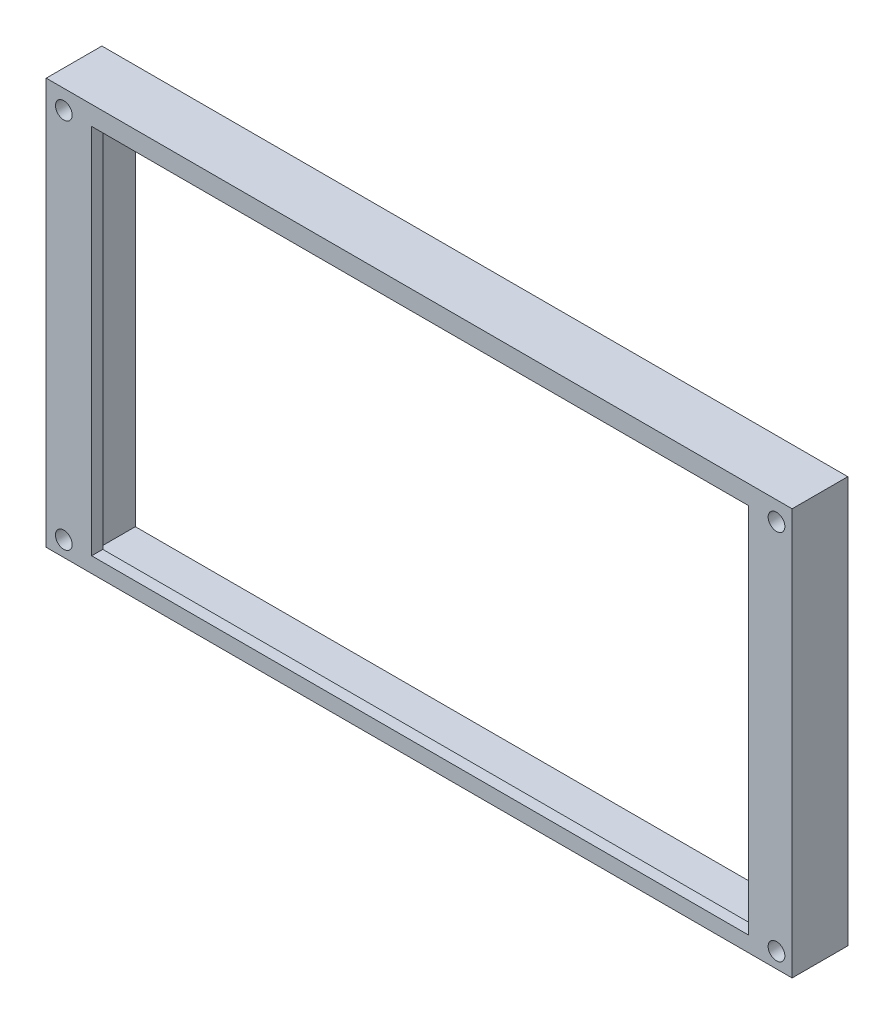
ISO-10303-21;
HEADER;
FILE_DESCRIPTION(('STEP AP214'),'2;1');
FILE_NAME('part.step','',(''),(''),'','','');
FILE_SCHEMA(('AUTOMOTIVE_DESIGN { 1 0 10303 214 1 1 1 1 }'));
ENDSEC;
DATA;
#1=APPLICATION_CONTEXT('core data for automotive mechanical design processes');
#2=APPLICATION_PROTOCOL_DEFINITION('international standard','automotive_design',2000,#1);
#3=PRODUCT_CONTEXT('',#1,'mechanical');
#4=PRODUCT('Part','Part','',(#3));
#5=PRODUCT_RELATED_PRODUCT_CATEGORY('part','',(#4));
#6=PRODUCT_DEFINITION_FORMATION('','',#4);
#7=PRODUCT_DEFINITION_CONTEXT('part definition',#1,'design');
#8=PRODUCT_DEFINITION('design','',#6,#7);
#9=PRODUCT_DEFINITION_SHAPE('','',#8);
#10=(LENGTH_UNIT() NAMED_UNIT(*) SI_UNIT(.MILLI.,.METRE.));
#11=(NAMED_UNIT(*) PLANE_ANGLE_UNIT() SI_UNIT($,.RADIAN.));
#12=(NAMED_UNIT(*) SI_UNIT($,.STERADIAN.) SOLID_ANGLE_UNIT());
#13=UNCERTAINTY_MEASURE_WITH_UNIT(LENGTH_MEASURE(1.E-05),#10,'distance_accuracy_value','');
#14=(GEOMETRIC_REPRESENTATION_CONTEXT(3) GLOBAL_UNCERTAINTY_ASSIGNED_CONTEXT((#13)) GLOBAL_UNIT_ASSIGNED_CONTEXT((#10,
#11,#12)) REPRESENTATION_CONTEXT('',''));
#15=CARTESIAN_POINT('',(0.,0.,0.));
#16=DIRECTION('',(0.,0.,1.));
#17=DIRECTION('',(1.,0.,0.));
#18=AXIS2_PLACEMENT_3D('',#15,#16,#17);
#19=CARTESIAN_POINT('',(0.,-30.2006022237917,-8.));
#20=DIRECTION('',(0.,-1.,0.));
#21=DIRECTION('',(1.,0.,0.));
#22=AXIS2_PLACEMENT_3D('',#19,#20,#21);
#23=PLANE('',#22);
#24=DIRECTION('',(1.,0.,0.));
#25=VECTOR('',#24,1.);
#26=CARTESIAN_POINT('',(-40.7224562213866,-30.2006022237917,2.));
#27=LINE('',#26,#25);
#28=CARTESIAN_POINT('',(-44.7224562213866,-30.2006022237917,2.));
#29=VERTEX_POINT('',#28);
#30=CARTESIAN_POINT('',(89.2775437786134,-30.2006022237917,2.));
#31=VERTEX_POINT('',#30);
#32=EDGE_CURVE('E129',#29,#31,#27,.T.);
#33=ORIENTED_EDGE('',*,*,#32,.F.);
#34=DIRECTION('',(0.,0.,-1.));
#35=VECTOR('',#34,1.);
#36=CARTESIAN_POINT('',(-44.7224562213866,-30.2006022237917,-6.));
#37=LINE('',#36,#35);
#38=CARTESIAN_POINT('',(-44.7224562213866,-30.2006022237917,-8.));
#39=VERTEX_POINT('',#38);
#40=EDGE_CURVE('E131',#29,#39,#37,.T.);
#41=ORIENTED_EDGE('',*,*,#40,.T.);
#42=DIRECTION('',(1.,0.,0.));
#43=VECTOR('',#42,1.);
#44=CARTESIAN_POINT('',(0.,-30.2006022237917,-8.));
#45=LINE('',#44,#43);
#46=CARTESIAN_POINT('',(89.2775437786134,-30.2006022237917,-8.));
#47=VERTEX_POINT('',#46);
#48=EDGE_CURVE('E215',#39,#47,#45,.T.);
#49=ORIENTED_EDGE('',*,*,#48,.T.);
#50=DIRECTION('',(0.,0.,-1.));
#51=VECTOR('',#50,1.);
#52=CARTESIAN_POINT('',(89.2775437786134,-30.2006022237917,-6.));
#53=LINE('',#52,#51);
#54=EDGE_CURVE('E134',#31,#47,#53,.T.);
#55=ORIENTED_EDGE('',*,*,#54,.F.);
#56=EDGE_LOOP('',(#33,#41,#49,#55));
#57=FACE_BOUND('',#56,.T.);
#58=ADVANCED_FACE('F43',(#57),#23,.T.);
#59=CARTESIAN_POINT('',(-38.7062948401835,0.,-8.));
#60=DIRECTION('',(-1.,0.,0.));
#61=DIRECTION('',(0.,0.,1.));
#62=AXIS2_PLACEMENT_3D('',#59,#60,#61);
#63=PLANE('',#62);
#64=DIRECTION('',(0.,-1.,0.));
#65=VECTOR('',#64,1.);
#66=CARTESIAN_POINT('',(-38.7062948401835,0.,0.));
#67=LINE('',#66,#65);
#68=CARTESIAN_POINT('',(-38.7062948401835,41.0219281329816,0.));
#69=VERTEX_POINT('',#68);
#70=CARTESIAN_POINT('',(-38.7062948401835,-28.9780718670184,0.));
#71=VERTEX_POINT('',#70);
#72=EDGE_CURVE('E202',#69,#71,#67,.T.);
#73=ORIENTED_EDGE('',*,*,#72,.T.);
#74=DIRECTION('',(0.,0.,1.));
#75=VECTOR('',#74,1.);
#76=CARTESIAN_POINT('',(-38.7062948401835,-28.9780718670184,-8.));
#77=LINE('',#76,#75);
#78=CARTESIAN_POINT('',(-38.7062948401835,-28.9780718670184,-8.));
#79=VERTEX_POINT('',#78);
#80=EDGE_CURVE('E11',#79,#71,#77,.T.);
#81=ORIENTED_EDGE('',*,*,#80,.F.);
#82=DIRECTION('',(0.,-1.,0.));
#83=VECTOR('',#82,1.);
#84=CARTESIAN_POINT('',(-38.7062948401835,0.,-8.));
#85=LINE('',#84,#83);
#86=CARTESIAN_POINT('',(-38.7062948401835,41.0219281329816,-8.));
#87=VERTEX_POINT('',#86);
#88=EDGE_CURVE('E203',#87,#79,#85,.T.);
#89=ORIENTED_EDGE('',*,*,#88,.F.);
#90=DIRECTION('',(0.,0.,1.));
#91=VECTOR('',#90,1.);
#92=CARTESIAN_POINT('',(-38.7062948401835,41.0219281329816,-8.));
#93=LINE('',#92,#91);
#94=EDGE_CURVE('E47',#87,#69,#93,.T.);
#95=ORIENTED_EDGE('',*,*,#94,.T.);
#96=EDGE_LOOP('',(#73,#81,#89,#95));
#97=FACE_BOUND('',#96,.T.);
#98=ADVANCED_FACE('F45',(#97),#63,.F.);
#99=CARTESIAN_POINT('',(0.,-28.9780718670184,-8.));
#100=DIRECTION('',(0.,-1.,0.));
#101=DIRECTION('',(0.,0.,-1.));
#102=AXIS2_PLACEMENT_3D('',#99,#100,#101);
#103=PLANE('',#102);
#104=DIRECTION('',(1.,0.,0.));
#105=VECTOR('',#104,1.);
#106=CARTESIAN_POINT('',(0.,-28.9780718670184,0.));
#107=LINE('',#106,#105);
#108=CARTESIAN_POINT('',(83.2937051598166,-28.9780718670184,0.));
#109=VERTEX_POINT('',#108);
#110=EDGE_CURVE('E206',#71,#109,#107,.T.);
#111=ORIENTED_EDGE('',*,*,#110,.T.);
#112=DIRECTION('',(0.,0.,1.));
#113=VECTOR('',#112,1.);
#114=CARTESIAN_POINT('',(83.2937051598166,-28.9780718670184,-8.));
#115=LINE('',#114,#113);
#116=CARTESIAN_POINT('',(83.2937051598166,-28.9780718670184,-8.));
#117=VERTEX_POINT('',#116);
#118=EDGE_CURVE('E53',#117,#109,#115,.T.);
#119=ORIENTED_EDGE('',*,*,#118,.F.);
#120=DIRECTION('',(1.,0.,0.));
#121=VECTOR('',#120,1.);
#122=CARTESIAN_POINT('',(0.,-28.9780718670184,-8.));
#123=LINE('',#122,#121);
#124=EDGE_CURVE('E60',#79,#117,#123,.T.);
#125=ORIENTED_EDGE('',*,*,#124,.F.);
#126=ORIENTED_EDGE('',*,*,#80,.T.);
#127=EDGE_LOOP('',(#111,#119,#125,#126));
#128=FACE_BOUND('',#127,.T.);
#129=ADVANCED_FACE('F241',(#128),#103,.F.);
#130=CARTESIAN_POINT('',(83.2937051598166,0.,-8.));
#131=DIRECTION('',(-1.,0.,0.));
#132=DIRECTION('',(0.,-1.,0.));
#133=AXIS2_PLACEMENT_3D('',#130,#131,#132);
#134=PLANE('',#133);
#135=DIRECTION('',(0.,-1.,0.));
#136=VECTOR('',#135,1.);
#137=CARTESIAN_POINT('',(83.2937051598166,0.,0.));
#138=LINE('',#137,#136);
#139=CARTESIAN_POINT('',(83.2937051598165,41.0219281329816,0.));
#140=VERTEX_POINT('',#139);
#141=EDGE_CURVE('E221',#140,#109,#138,.T.);
#142=ORIENTED_EDGE('',*,*,#141,.F.);
#143=DIRECTION('',(0.,0.,1.));
#144=VECTOR('',#143,1.);
#145=CARTESIAN_POINT('',(83.2937051598165,41.0219281329816,-8.));
#146=LINE('',#145,#144);
#147=CARTESIAN_POINT('',(83.2937051598165,41.0219281329816,-8.));
#148=VERTEX_POINT('',#147);
#149=EDGE_CURVE('E227',#148,#140,#146,.T.);
#150=ORIENTED_EDGE('',*,*,#149,.F.);
#151=DIRECTION('',(0.,-1.,0.));
#152=VECTOR('',#151,1.);
#153=CARTESIAN_POINT('',(83.2937051598166,0.,-8.));
#154=LINE('',#153,#152);
#155=EDGE_CURVE('E209',#148,#117,#154,.T.);
#156=ORIENTED_EDGE('',*,*,#155,.T.);
#157=ORIENTED_EDGE('',*,*,#118,.T.);
#158=EDGE_LOOP('',(#142,#150,#156,#157));
#159=FACE_BOUND('',#158,.T.);
#160=ADVANCED_FACE('F243',(#159),#134,.T.);
#161=CARTESIAN_POINT('',(0.,41.0219281329816,-8.));
#162=DIRECTION('',(0.,-1.,0.));
#163=DIRECTION('',(0.,0.,-1.));
#164=AXIS2_PLACEMENT_3D('',#161,#162,#163);
#165=PLANE('',#164);
#166=DIRECTION('',(1.,0.,0.));
#167=VECTOR('',#166,1.);
#168=CARTESIAN_POINT('',(0.,41.0219281329816,0.));
#169=LINE('',#168,#167);
#170=EDGE_CURVE('E219',#69,#140,#169,.T.);
#171=ORIENTED_EDGE('',*,*,#170,.F.);
#172=ORIENTED_EDGE('',*,*,#94,.F.);
#173=DIRECTION('',(1.,0.,0.));
#174=VECTOR('',#173,1.);
#175=CARTESIAN_POINT('',(0.,41.0219281329816,-8.));
#176=LINE('',#175,#174);
#177=EDGE_CURVE('E205',#87,#148,#176,.T.);
#178=ORIENTED_EDGE('',*,*,#177,.T.);
#179=ORIENTED_EDGE('',*,*,#149,.T.);
#180=EDGE_LOOP('',(#171,#172,#178,#179));
#181=FACE_BOUND('',#180,.T.);
#182=ADVANCED_FACE('F237',(#181),#165,.T.);
#183=CARTESIAN_POINT('',(0.,42.7993977762083,-8.));
#184=DIRECTION('',(0.,-1.,0.));
#185=DIRECTION('',(1.,0.,0.));
#186=AXIS2_PLACEMENT_3D('',#183,#184,#185);
#187=PLANE('',#186);
#188=DIRECTION('',(0.,0.,-1.));
#189=VECTOR('',#188,1.);
#190=CARTESIAN_POINT('',(-44.7224562213866,42.7993977762083,-6.));
#191=LINE('',#190,#189);
#192=CARTESIAN_POINT('',(-44.7224562213866,42.7993977762083,2.));
#193=VERTEX_POINT('',#192);
#194=CARTESIAN_POINT('',(-44.7224562213866,42.7993977762083,-8.));
#195=VERTEX_POINT('',#194);
#196=EDGE_CURVE('E149',#193,#195,#191,.T.);
#197=ORIENTED_EDGE('',*,*,#196,.F.);
#198=DIRECTION('',(-1.,0.,0.));
#199=VECTOR('',#198,1.);
#200=CARTESIAN_POINT('',(-40.7224562213866,42.7993977762083,2.));
#201=LINE('',#200,#199);
#202=CARTESIAN_POINT('',(89.2775437786134,42.7993977762083,2.));
#203=VERTEX_POINT('',#202);
#204=EDGE_CURVE('E139',#203,#193,#201,.T.);
#205=ORIENTED_EDGE('',*,*,#204,.F.);
#206=DIRECTION('',(0.,0.,-1.));
#207=VECTOR('',#206,1.);
#208=CARTESIAN_POINT('',(89.2775437786134,42.7993977762083,-6.));
#209=LINE('',#208,#207);
#210=CARTESIAN_POINT('',(89.2775437786134,42.7993977762083,-8.));
#211=VERTEX_POINT('',#210);
#212=EDGE_CURVE('E167',#203,#211,#209,.T.);
#213=ORIENTED_EDGE('',*,*,#212,.T.);
#214=DIRECTION('',(1.,0.,0.));
#215=VECTOR('',#214,1.);
#216=CARTESIAN_POINT('',(0.,42.7993977762083,-8.));
#217=LINE('',#216,#215);
#218=EDGE_CURVE('E213',#195,#211,#217,.T.);
#219=ORIENTED_EDGE('',*,*,#218,.F.);
#220=EDGE_LOOP('',(#197,#205,#213,#219));
#221=FACE_BOUND('',#220,.T.);
#222=ADVANCED_FACE('F261',(#221),#187,.F.);
#223=CARTESIAN_POINT('',(0.,0.,-8.));
#224=DIRECTION('',(0.,0.,1.));
#225=DIRECTION('',(1.,0.,0.));
#226=AXIS2_PLACEMENT_3D('',#223,#224,#225);
#227=PLANE('',#226);
#228=CARTESIAN_POINT('',(86.4706408932873,39.3731342771137,-8.));
#229=DIRECTION('',(0.,0.,1.));
#230=DIRECTION('',(1.,0.,0.));
#231=AXIS2_PLACEMENT_3D('',#228,#229,#230);
#232=CIRCLE('',#231,1.5);
#233=CARTESIAN_POINT('',(87.9706408932873,39.3731342771137,-8.));
#234=VERTEX_POINT('',#233);
#235=EDGE_CURVE('E450',#234,#234,#232,.T.);
#236=ORIENTED_EDGE('',*,*,#235,.T.);
#237=EDGE_LOOP('',(#236));
#238=FACE_BOUND('',#237,.T.);
#239=CARTESIAN_POINT('',(-41.5584991871856,39.3731342771137,-8.));
#240=DIRECTION('',(0.,0.,1.));
#241=DIRECTION('',(1.,0.,0.));
#242=AXIS2_PLACEMENT_3D('',#239,#240,#241);
#243=CIRCLE('',#242,1.5);
#244=CARTESIAN_POINT('',(-40.0584991871856,39.3731342771137,-8.));
#245=VERTEX_POINT('',#244);
#246=EDGE_CURVE('E471',#245,#245,#243,.T.);
#247=ORIENTED_EDGE('',*,*,#246,.T.);
#248=EDGE_LOOP('',(#247));
#249=FACE_BOUND('',#248,.T.);
#250=CARTESIAN_POINT('',(-41.5584991871856,-27.4326851785472,-8.));
#251=DIRECTION('',(0.,0.,1.));
#252=DIRECTION('',(1.,0.,0.));
#253=AXIS2_PLACEMENT_3D('',#250,#251,#252);
#254=CIRCLE('',#253,1.5);
#255=CARTESIAN_POINT('',(-40.0584991871856,-27.4326851785472,-8.));
#256=VERTEX_POINT('',#255);
#257=EDGE_CURVE('E462',#256,#256,#254,.T.);
#258=ORIENTED_EDGE('',*,*,#257,.T.);
#259=EDGE_LOOP('',(#258));
#260=FACE_BOUND('',#259,.T.);
#261=CARTESIAN_POINT('',(86.4706408932873,-27.4326851785472,-8.));
#262=DIRECTION('',(0.,0.,1.));
#263=DIRECTION('',(1.,0.,0.));
#264=AXIS2_PLACEMENT_3D('',#261,#262,#263);
#265=CIRCLE('',#264,1.5);
#266=CARTESIAN_POINT('',(87.9706408932873,-27.4326851785472,-8.));
#267=VERTEX_POINT('',#266);
#268=EDGE_CURVE('E157',#267,#267,#265,.T.);
#269=ORIENTED_EDGE('',*,*,#268,.T.);
#270=EDGE_LOOP('',(#269));
#271=FACE_BOUND('',#270,.T.);
#272=ORIENTED_EDGE('',*,*,#88,.T.);
#273=ORIENTED_EDGE('',*,*,#124,.T.);
#274=ORIENTED_EDGE('',*,*,#155,.F.);
#275=ORIENTED_EDGE('',*,*,#177,.F.);
#276=EDGE_LOOP('',(#272,#273,#274,#275));
#277=FACE_BOUND('',#276,.T.);
#278=ORIENTED_EDGE('',*,*,#218,.T.);
#279=DIRECTION('',(0.,-1.,0.));
#280=VECTOR('',#279,1.);
#281=CARTESIAN_POINT('',(89.2775437786134,42.7993977762083,-8.));
#282=LINE('',#281,#280);
#283=EDGE_CURVE('E163',#211,#47,#282,.T.);
#284=ORIENTED_EDGE('',*,*,#283,.T.);
#285=ORIENTED_EDGE('',*,*,#48,.F.);
#286=DIRECTION('',(0.,1.,0.));
#287=VECTOR('',#286,1.);
#288=CARTESIAN_POINT('',(-44.7224562213866,42.7993977762083,-8.));
#289=LINE('',#288,#287);
#290=EDGE_CURVE('E148',#39,#195,#289,.T.);
#291=ORIENTED_EDGE('',*,*,#290,.T.);
#292=EDGE_LOOP('',(#278,#284,#285,#291));
#293=FACE_BOUND('',#292,.T.);
#294=ADVANCED_FACE('F259',(#238,#249,#260,#271,#277,#293),#227,.F.);
#295=CARTESIAN_POINT('',(0.,0.,2.));
#296=DIRECTION('',(0.,0.,1.));
#297=DIRECTION('',(1.,0.,0.));
#298=AXIS2_PLACEMENT_3D('',#295,#296,#297);
#299=PLANE('',#298);
#300=CARTESIAN_POINT('',(86.4706408932873,39.3731342771137,2.));
#301=DIRECTION('',(0.,0.,1.));
#302=DIRECTION('',(1.,0.,0.));
#303=AXIS2_PLACEMENT_3D('',#300,#301,#302);
#304=CIRCLE('',#303,1.5);
#305=CARTESIAN_POINT('',(87.9706408932873,39.3731342771137,2.));
#306=VERTEX_POINT('',#305);
#307=EDGE_CURVE('E453',#306,#306,#304,.T.);
#308=ORIENTED_EDGE('',*,*,#307,.F.);
#309=EDGE_LOOP('',(#308));
#310=FACE_BOUND('',#309,.T.);
#311=CARTESIAN_POINT('',(-41.5584991871856,39.3731342771137,2.));
#312=DIRECTION('',(0.,0.,1.));
#313=DIRECTION('',(1.,0.,0.));
#314=AXIS2_PLACEMENT_3D('',#311,#312,#313);
#315=CIRCLE('',#314,1.5);
#316=CARTESIAN_POINT('',(-40.0584991871856,39.3731342771137,2.));
#317=VERTEX_POINT('',#316);
#318=EDGE_CURVE('E455',#317,#317,#315,.T.);
#319=ORIENTED_EDGE('',*,*,#318,.F.);
#320=EDGE_LOOP('',(#319));
#321=FACE_BOUND('',#320,.T.);
#322=CARTESIAN_POINT('',(-41.5584991871856,-27.4326851785472,2.));
#323=DIRECTION('',(0.,0.,1.));
#324=DIRECTION('',(1.,0.,0.));
#325=AXIS2_PLACEMENT_3D('',#322,#323,#324);
#326=CIRCLE('',#325,1.5);
#327=CARTESIAN_POINT('',(-40.0584991871856,-27.4326851785472,2.));
#328=VERTEX_POINT('',#327);
#329=EDGE_CURVE('E466',#328,#328,#326,.T.);
#330=ORIENTED_EDGE('',*,*,#329,.F.);
#331=EDGE_LOOP('',(#330));
#332=FACE_BOUND('',#331,.T.);
#333=CARTESIAN_POINT('',(86.4706408932873,-27.4326851785472,2.));
#334=DIRECTION('',(0.,0.,1.));
#335=DIRECTION('',(1.,0.,0.));
#336=AXIS2_PLACEMENT_3D('',#333,#334,#335);
#337=CIRCLE('',#336,1.5);
#338=CARTESIAN_POINT('',(87.9706408932873,-27.4326851785472,2.));
#339=VERTEX_POINT('',#338);
#340=EDGE_CURVE('E160',#339,#339,#337,.T.);
#341=ORIENTED_EDGE('',*,*,#340,.F.);
#342=EDGE_LOOP('',(#341));
#343=FACE_BOUND('',#342,.T.);
#344=ORIENTED_EDGE('',*,*,#204,.T.);
#345=DIRECTION('',(0.,-1.,0.));
#346=VECTOR('',#345,1.);
#347=CARTESIAN_POINT('',(-44.7224562213866,42.7993977762083,2.));
#348=LINE('',#347,#346);
#349=EDGE_CURVE('E146',#193,#29,#348,.T.);
#350=ORIENTED_EDGE('',*,*,#349,.T.);
#351=ORIENTED_EDGE('',*,*,#32,.T.);
#352=DIRECTION('',(0.,1.,0.));
#353=VECTOR('',#352,1.);
#354=CARTESIAN_POINT('',(89.2775437786134,42.7993977762083,2.));
#355=LINE('',#354,#353);
#356=EDGE_CURVE('E154',#31,#203,#355,.T.);
#357=ORIENTED_EDGE('',*,*,#356,.T.);
#358=EDGE_LOOP('',(#344,#350,#351,#357));
#359=FACE_BOUND('',#358,.T.);
#360=DIRECTION('',(1.,0.,0.));
#361=VECTOR('',#360,1.);
#362=CARTESIAN_POINT('',(-36.5584991871856,-27.4326851785472,2.));
#363=LINE('',#362,#361);
#364=CARTESIAN_POINT('',(-36.5584991871856,-27.4326851785472,2.));
#365=VERTEX_POINT('',#364);
#366=CARTESIAN_POINT('',(81.4706408932873,-27.4326851785472,2.));
#367=VERTEX_POINT('',#366);
#368=EDGE_CURVE('E174',#365,#367,#363,.T.);
#369=ORIENTED_EDGE('',*,*,#368,.F.);
#370=DIRECTION('',(0.,-1.,0.));
#371=VECTOR('',#370,1.);
#372=CARTESIAN_POINT('',(-36.5584991871856,39.3731342771137,2.));
#373=LINE('',#372,#371);
#374=CARTESIAN_POINT('',(-36.5584991871856,39.3731342771137,2.));
#375=VERTEX_POINT('',#374);
#376=EDGE_CURVE('E172',#375,#365,#373,.T.);
#377=ORIENTED_EDGE('',*,*,#376,.F.);
#378=DIRECTION('',(-1.,0.,0.));
#379=VECTOR('',#378,1.);
#380=CARTESIAN_POINT('',(-36.5584991871856,39.3731342771137,2.));
#381=LINE('',#380,#379);
#382=CARTESIAN_POINT('',(81.4706408932873,39.3731342771137,2.));
#383=VERTEX_POINT('',#382);
#384=EDGE_CURVE('E180',#383,#375,#381,.T.);
#385=ORIENTED_EDGE('',*,*,#384,.F.);
#386=DIRECTION('',(0.,1.,0.));
#387=VECTOR('',#386,1.);
#388=CARTESIAN_POINT('',(81.4706408932873,39.3731342771137,2.));
#389=LINE('',#388,#387);
#390=EDGE_CURVE('E177',#367,#383,#389,.T.);
#391=ORIENTED_EDGE('',*,*,#390,.F.);
#392=EDGE_LOOP('',(#369,#377,#385,#391));
#393=FACE_BOUND('',#392,.T.);
#394=ADVANCED_FACE('F151',(#310,#321,#332,#343,#359,#393),#299,.T.);
#395=CARTESIAN_POINT('',(0.,0.,0.));
#396=DIRECTION('',(0.,0.,1.));
#397=DIRECTION('',(1.,0.,0.));
#398=AXIS2_PLACEMENT_3D('',#395,#396,#397);
#399=PLANE('',#398);
#400=ORIENTED_EDGE('',*,*,#72,.F.);
#401=ORIENTED_EDGE('',*,*,#170,.T.);
#402=ORIENTED_EDGE('',*,*,#141,.T.);
#403=ORIENTED_EDGE('',*,*,#110,.F.);
#404=EDGE_LOOP('',(#400,#401,#402,#403));
#405=FACE_BOUND('',#404,.T.);
#406=DIRECTION('',(0.,-1.,0.));
#407=VECTOR('',#406,1.);
#408=CARTESIAN_POINT('',(-36.5584991871856,39.3731342771137,0.));
#409=LINE('',#408,#407);
#410=CARTESIAN_POINT('',(-36.5584991871856,39.3731342771137,0.));
#411=VERTEX_POINT('',#410);
#412=CARTESIAN_POINT('',(-36.5584991871856,-27.4326851785472,0.));
#413=VERTEX_POINT('',#412);
#414=EDGE_CURVE('E169',#411,#413,#409,.T.);
#415=ORIENTED_EDGE('',*,*,#414,.T.);
#416=DIRECTION('',(1.,0.,0.));
#417=VECTOR('',#416,1.);
#418=CARTESIAN_POINT('',(-36.5584991871856,-27.4326851785472,0.));
#419=LINE('',#418,#417);
#420=CARTESIAN_POINT('',(81.4706408932873,-27.4326851785472,0.));
#421=VERTEX_POINT('',#420);
#422=EDGE_CURVE('E185',#413,#421,#419,.T.);
#423=ORIENTED_EDGE('',*,*,#422,.T.);
#424=DIRECTION('',(0.,1.,0.));
#425=VECTOR('',#424,1.);
#426=CARTESIAN_POINT('',(81.4706408932873,39.3731342771137,0.));
#427=LINE('',#426,#425);
#428=CARTESIAN_POINT('',(81.4706408932873,39.3731342771137,0.));
#429=VERTEX_POINT('',#428);
#430=EDGE_CURVE('E188',#421,#429,#427,.T.);
#431=ORIENTED_EDGE('',*,*,#430,.T.);
#432=DIRECTION('',(-1.,0.,0.));
#433=VECTOR('',#432,1.);
#434=CARTESIAN_POINT('',(-36.5584991871856,39.3731342771137,0.));
#435=LINE('',#434,#433);
#436=EDGE_CURVE('E175',#429,#411,#435,.T.);
#437=ORIENTED_EDGE('',*,*,#436,.T.);
#438=EDGE_LOOP('',(#415,#423,#431,#437));
#439=FACE_BOUND('',#438,.T.);
#440=ADVANCED_FACE('F239',(#405,#439),#399,.F.);
#441=CARTESIAN_POINT('',(-36.5584991871856,39.3731342771137,2.));
#442=DIRECTION('',(1.,0.,0.));
#443=DIRECTION('',(0.,0.,-1.));
#444=AXIS2_PLACEMENT_3D('',#441,#442,#443);
#445=PLANE('',#444);
#446=ORIENTED_EDGE('',*,*,#414,.F.);
#447=DIRECTION('',(0.,0.,-1.));
#448=VECTOR('',#447,1.);
#449=CARTESIAN_POINT('',(-36.5584991871856,39.3731342771137,2.));
#450=LINE('',#449,#448);
#451=EDGE_CURVE('E182',#375,#411,#450,.T.);
#452=ORIENTED_EDGE('',*,*,#451,.F.);
#453=ORIENTED_EDGE('',*,*,#376,.T.);
#454=DIRECTION('',(0.,0.,-1.));
#455=VECTOR('',#454,1.);
#456=CARTESIAN_POINT('',(-36.5584991871856,-27.4326851785472,2.));
#457=LINE('',#456,#455);
#458=EDGE_CURVE('E140',#365,#413,#457,.T.);
#459=ORIENTED_EDGE('',*,*,#458,.T.);
#460=EDGE_LOOP('',(#446,#452,#453,#459));
#461=FACE_BOUND('',#460,.T.);
#462=ADVANCED_FACE('F292',(#461),#445,.T.);
#463=CARTESIAN_POINT('',(-36.5584991871856,-27.4326851785472,2.));
#464=DIRECTION('',(0.,1.,0.));
#465=DIRECTION('',(0.,0.,1.));
#466=AXIS2_PLACEMENT_3D('',#463,#464,#465);
#467=PLANE('',#466);
#468=ORIENTED_EDGE('',*,*,#422,.F.);
#469=ORIENTED_EDGE('',*,*,#458,.F.);
#470=ORIENTED_EDGE('',*,*,#368,.T.);
#471=DIRECTION('',(0.,0.,-1.));
#472=VECTOR('',#471,1.);
#473=CARTESIAN_POINT('',(81.4706408932873,-27.4326851785472,2.));
#474=LINE('',#473,#472);
#475=EDGE_CURVE('E197',#367,#421,#474,.T.);
#476=ORIENTED_EDGE('',*,*,#475,.T.);
#477=EDGE_LOOP('',(#468,#469,#470,#476));
#478=FACE_BOUND('',#477,.T.);
#479=ADVANCED_FACE('F288',(#478),#467,.T.);
#480=CARTESIAN_POINT('',(81.4706408932873,39.3731342771137,2.));
#481=DIRECTION('',(-1.,0.,0.));
#482=DIRECTION('',(0.,0.,1.));
#483=AXIS2_PLACEMENT_3D('',#480,#481,#482);
#484=PLANE('',#483);
#485=ORIENTED_EDGE('',*,*,#430,.F.);
#486=ORIENTED_EDGE('',*,*,#475,.F.);
#487=ORIENTED_EDGE('',*,*,#390,.T.);
#488=DIRECTION('',(0.,0.,-1.));
#489=VECTOR('',#488,1.);
#490=CARTESIAN_POINT('',(81.4706408932873,39.3731342771137,2.));
#491=LINE('',#490,#489);
#492=EDGE_CURVE('E195',#383,#429,#491,.T.);
#493=ORIENTED_EDGE('',*,*,#492,.T.);
#494=EDGE_LOOP('',(#485,#486,#487,#493));
#495=FACE_BOUND('',#494,.T.);
#496=ADVANCED_FACE('F281',(#495),#484,.T.);
#497=CARTESIAN_POINT('',(-36.5584991871856,39.3731342771137,2.));
#498=DIRECTION('',(0.,-1.,0.));
#499=DIRECTION('',(0.,0.,-1.));
#500=AXIS2_PLACEMENT_3D('',#497,#498,#499);
#501=PLANE('',#500);
#502=ORIENTED_EDGE('',*,*,#436,.F.);
#503=ORIENTED_EDGE('',*,*,#492,.F.);
#504=ORIENTED_EDGE('',*,*,#384,.T.);
#505=ORIENTED_EDGE('',*,*,#451,.T.);
#506=EDGE_LOOP('',(#502,#503,#504,#505));
#507=FACE_BOUND('',#506,.T.);
#508=ADVANCED_FACE('F274',(#507),#501,.T.);
#509=CARTESIAN_POINT('',(89.2775437786134,42.7993977762083,-6.));
#510=DIRECTION('',(1.,0.,0.));
#511=DIRECTION('',(0.,1.,0.));
#512=AXIS2_PLACEMENT_3D('',#509,#510,#511);
#513=PLANE('',#512);
#514=ORIENTED_EDGE('',*,*,#283,.F.);
#515=ORIENTED_EDGE('',*,*,#212,.F.);
#516=ORIENTED_EDGE('',*,*,#356,.F.);
#517=ORIENTED_EDGE('',*,*,#54,.T.);
#518=EDGE_LOOP('',(#514,#515,#516,#517));
#519=FACE_BOUND('',#518,.T.);
#520=ADVANCED_FACE('F273',(#519),#513,.T.);
#521=CARTESIAN_POINT('',(-44.7224562213866,42.7993977762083,-6.));
#522=DIRECTION('',(-1.,0.,0.));
#523=DIRECTION('',(0.,-1.,0.));
#524=AXIS2_PLACEMENT_3D('',#521,#522,#523);
#525=PLANE('',#524);
#526=ORIENTED_EDGE('',*,*,#290,.F.);
#527=ORIENTED_EDGE('',*,*,#40,.F.);
#528=ORIENTED_EDGE('',*,*,#349,.F.);
#529=ORIENTED_EDGE('',*,*,#196,.T.);
#530=EDGE_LOOP('',(#526,#527,#528,#529));
#531=FACE_BOUND('',#530,.T.);
#532=ADVANCED_FACE('F144',(#531),#525,.T.);
#533=CARTESIAN_POINT('',(86.4706408932873,-27.4326851785472,-8.));
#534=DIRECTION('',(0.,0.,1.));
#535=DIRECTION('',(1.,0.,0.));
#536=AXIS2_PLACEMENT_3D('',#533,#534,#535);
#537=CYLINDRICAL_SURFACE('',#536,1.5);
#538=ORIENTED_EDGE('',*,*,#268,.F.);
#539=EDGE_LOOP('',(#538));
#540=FACE_BOUND('',#539,.T.);
#541=ORIENTED_EDGE('',*,*,#340,.T.);
#542=EDGE_LOOP('',(#541));
#543=FACE_BOUND('',#542,.T.);
#544=ADVANCED_FACE('F279',(#540,#543),#537,.F.);
#545=CARTESIAN_POINT('',(-41.5584991871856,-27.4326851785472,-8.));
#546=DIRECTION('',(0.,0.,1.));
#547=DIRECTION('',(1.,0.,0.));
#548=AXIS2_PLACEMENT_3D('',#545,#546,#547);
#549=CYLINDRICAL_SURFACE('',#548,1.5);
#550=ORIENTED_EDGE('',*,*,#257,.F.);
#551=EDGE_LOOP('',(#550));
#552=FACE_BOUND('',#551,.T.);
#553=ORIENTED_EDGE('',*,*,#329,.T.);
#554=EDGE_LOOP('',(#553));
#555=FACE_BOUND('',#554,.T.);
#556=ADVANCED_FACE('F412',(#552,#555),#549,.F.);
#557=CARTESIAN_POINT('',(-41.5584991871856,39.3731342771137,-8.));
#558=DIRECTION('',(0.,0.,1.));
#559=DIRECTION('',(1.,0.,0.));
#560=AXIS2_PLACEMENT_3D('',#557,#558,#559);
#561=CYLINDRICAL_SURFACE('',#560,1.5);
#562=ORIENTED_EDGE('',*,*,#246,.F.);
#563=EDGE_LOOP('',(#562));
#564=FACE_BOUND('',#563,.T.);
#565=ORIENTED_EDGE('',*,*,#318,.T.);
#566=EDGE_LOOP('',(#565));
#567=FACE_BOUND('',#566,.T.);
#568=ADVANCED_FACE('F420',(#564,#567),#561,.F.);
#569=CARTESIAN_POINT('',(86.4706408932873,39.3731342771137,-8.));
#570=DIRECTION('',(0.,0.,1.));
#571=DIRECTION('',(1.,0.,0.));
#572=AXIS2_PLACEMENT_3D('',#569,#570,#571);
#573=CYLINDRICAL_SURFACE('',#572,1.5);
#574=ORIENTED_EDGE('',*,*,#235,.F.);
#575=EDGE_LOOP('',(#574));
#576=FACE_BOUND('',#575,.T.);
#577=ORIENTED_EDGE('',*,*,#307,.T.);
#578=EDGE_LOOP('',(#577));
#579=FACE_BOUND('',#578,.T.);
#580=ADVANCED_FACE('F429',(#576,#579),#573,.F.);
#581=CLOSED_SHELL('',(#58,#98,#129,#160,#182,#222,#294,#394,#440,#462,#479,#496,#508,#520,#532,
#544,#556,#568,#580));
#582=MANIFOLD_SOLID_BREP('B2',#581);
#583=ADVANCED_BREP_SHAPE_REPRESENTATION('',(#18,#582),#14);
#584=SHAPE_DEFINITION_REPRESENTATION(#9,#583);
ENDSEC;
END-ISO-10303-21;
